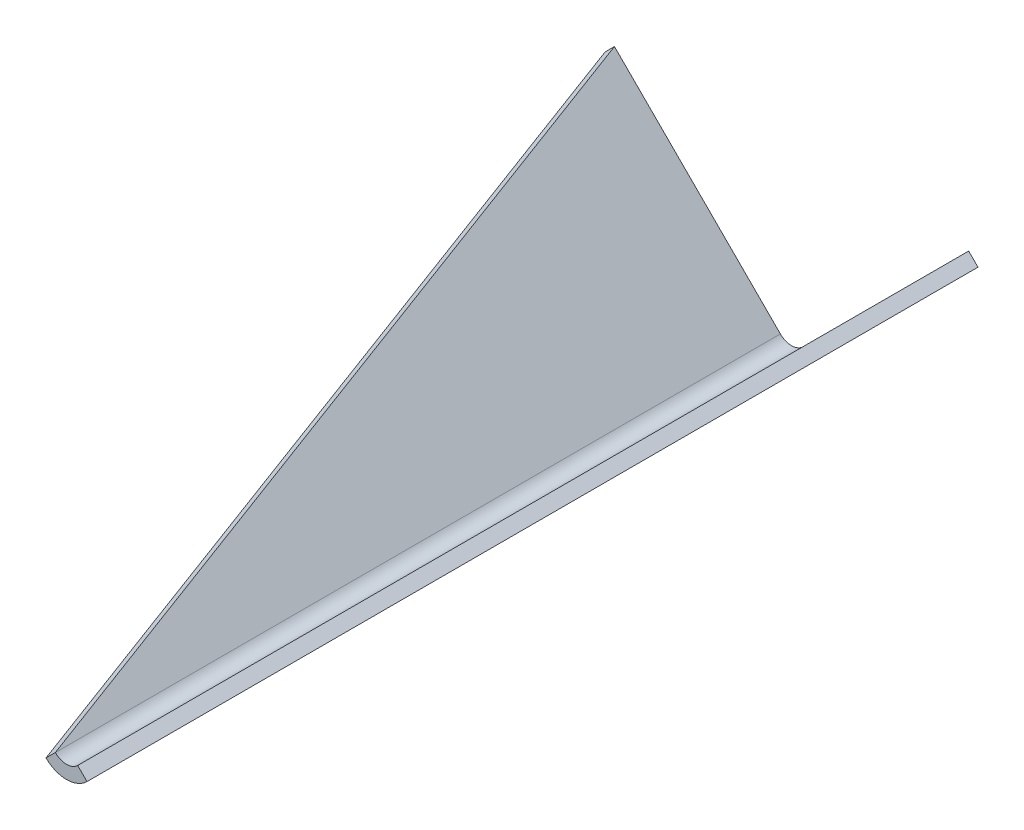
ISO-10303-21;
HEADER;
FILE_DESCRIPTION(('STEP AP214'),'2;1');
FILE_NAME('part.step','',(''),(''),'','','');
FILE_SCHEMA(('AUTOMOTIVE_DESIGN { 1 0 10303 214 1 1 1 1 }'));
ENDSEC;
DATA;
#1=APPLICATION_CONTEXT('core data for automotive mechanical design processes');
#2=APPLICATION_PROTOCOL_DEFINITION('international standard','automotive_design',2000,#1);
#3=PRODUCT_CONTEXT('',#1,'mechanical');
#4=PRODUCT('Part','Part','',(#3));
#5=PRODUCT_RELATED_PRODUCT_CATEGORY('part','',(#4));
#6=PRODUCT_DEFINITION_FORMATION('','',#4);
#7=PRODUCT_DEFINITION_CONTEXT('part definition',#1,'design');
#8=PRODUCT_DEFINITION('design','',#6,#7);
#9=PRODUCT_DEFINITION_SHAPE('','',#8);
#10=(LENGTH_UNIT() NAMED_UNIT(*) SI_UNIT(.MILLI.,.METRE.));
#11=(NAMED_UNIT(*) PLANE_ANGLE_UNIT() SI_UNIT($,.RADIAN.));
#12=(NAMED_UNIT(*) SI_UNIT($,.STERADIAN.) SOLID_ANGLE_UNIT());
#13=UNCERTAINTY_MEASURE_WITH_UNIT(LENGTH_MEASURE(1.E-05),#10,'distance_accuracy_value','');
#14=(GEOMETRIC_REPRESENTATION_CONTEXT(3) GLOBAL_UNCERTAINTY_ASSIGNED_CONTEXT((#13)) GLOBAL_UNIT_ASSIGNED_CONTEXT((#10,
#11,#12)) REPRESENTATION_CONTEXT('',''));
#15=CARTESIAN_POINT('',(0.,0.,0.));
#16=DIRECTION('',(0.,0.,1.));
#17=DIRECTION('',(1.,0.,0.));
#18=AXIS2_PLACEMENT_3D('',#15,#16,#17);
#19=CARTESIAN_POINT('',(-1.55563491861041,1.55563491861041,55.));
#20=DIRECTION('',(0.,0.,1.));
#21=DIRECTION('',(1.,0.,0.));
#22=AXIS2_PLACEMENT_3D('',#19,#20,#21);
#23=PLANE('',#22);
#24=DIRECTION('',(0.707106781186547,0.707106781186548,0.));
#25=VECTOR('',#24,1.);
#26=CARTESIAN_POINT('',(-1.55563491861041,1.55563491861041,55.));
#27=LINE('',#26,#25);
#28=CARTESIAN_POINT('',(-1.5556349186104,1.55563491861041,55.));
#29=VERTEX_POINT('',#28);
#30=CARTESIAN_POINT('',(-0.848528137423858,2.26274169979695,55.));
#31=VERTEX_POINT('',#30);
#32=EDGE_CURVE('E11',#29,#31,#27,.T.);
#33=ORIENTED_EDGE('',*,*,#32,.F.);
#34=CARTESIAN_POINT('',(0.,3.11126983722081,55.));
#35=DIRECTION('',(0.,0.,1.));
#36=DIRECTION('',(1.,0.,0.));
#37=AXIS2_PLACEMENT_3D('',#34,#35,#36);
#38=CIRCLE('',#37,2.2);
#39=CARTESIAN_POINT('',(1.55563491861041,1.5556349186104,55.));
#40=VERTEX_POINT('',#39);
#41=EDGE_CURVE('E110',#40,#29,#38,.F.);
#42=ORIENTED_EDGE('',*,*,#41,.F.);
#43=DIRECTION('',(0.707106781186548,-0.707106781186547,0.));
#44=VECTOR('',#43,1.);
#45=CARTESIAN_POINT('',(0.848528137423857,2.26274169979695,55.));
#46=LINE('',#45,#44);
#47=CARTESIAN_POINT('',(0.848528137423857,2.26274169979695,55.));
#48=VERTEX_POINT('',#47);
#49=EDGE_CURVE('E49',#48,#40,#46,.T.);
#50=ORIENTED_EDGE('',*,*,#49,.F.);
#51=CARTESIAN_POINT('',(0.,3.11126983722081,55.));
#52=DIRECTION('',(0.,0.,1.));
#53=DIRECTION('',(1.,0.,0.));
#54=AXIS2_PLACEMENT_3D('',#51,#52,#53);
#55=CIRCLE('',#54,1.2);
#56=EDGE_CURVE('E105',#48,#31,#55,.F.);
#57=ORIENTED_EDGE('',*,*,#56,.T.);
#58=EDGE_LOOP('',(#33,#42,#50,#57));
#59=FACE_BOUND('',#58,.T.);
#60=ADVANCED_FACE('F41',(#59),#23,.T.);
#61=CARTESIAN_POINT('',(1.55563491861041,1.55563491861041,0.));
#62=DIRECTION('',(0.,0.,-1.));
#63=DIRECTION('',(-1.,0.,0.));
#64=AXIS2_PLACEMENT_3D('',#61,#62,#63);
#65=PLANE('',#64);
#66=DIRECTION('',(-0.707106781186548,0.707106781186547,0.));
#67=VECTOR('',#66,1.);
#68=CARTESIAN_POINT('',(1.55563491861041,1.55563491861041,0.));
#69=LINE('',#68,#67);
#70=CARTESIAN_POINT('',(1.55563491861041,1.55563491861041,0.));
#71=VERTEX_POINT('',#70);
#72=CARTESIAN_POINT('',(0.848528137423857,2.26274169979695,0.));
#73=VERTEX_POINT('',#72);
#74=EDGE_CURVE('E76',#71,#73,#69,.T.);
#75=ORIENTED_EDGE('',*,*,#74,.F.);
#76=CARTESIAN_POINT('',(0.,3.11126983722081,0.));
#77=DIRECTION('',(0.,0.,1.));
#78=DIRECTION('',(1.,0.,0.));
#79=AXIS2_PLACEMENT_3D('',#76,#77,#78);
#80=CIRCLE('',#79,2.2);
#81=CARTESIAN_POINT('',(-1.55563491861041,1.55563491861041,0.));
#82=VERTEX_POINT('',#81);
#83=EDGE_CURVE('E138',#71,#82,#80,.F.);
#84=ORIENTED_EDGE('',*,*,#83,.T.);
#85=DIRECTION('',(-0.707106781186547,-0.707106781186548,0.));
#86=VECTOR('',#85,1.);
#87=CARTESIAN_POINT('',(-0.848528137423858,2.26274169979695,0.));
#88=LINE('',#87,#86);
#89=CARTESIAN_POINT('',(-0.848528137423858,2.26274169979695,0.));
#90=VERTEX_POINT('',#89);
#91=EDGE_CURVE('E88',#90,#82,#88,.T.);
#92=ORIENTED_EDGE('',*,*,#91,.F.);
#93=CARTESIAN_POINT('',(0.,3.11126983722081,0.));
#94=DIRECTION('',(0.,0.,1.));
#95=DIRECTION('',(1.,0.,0.));
#96=AXIS2_PLACEMENT_3D('',#93,#94,#95);
#97=CIRCLE('',#96,1.2);
#98=EDGE_CURVE('E96',#73,#90,#97,.F.);
#99=ORIENTED_EDGE('',*,*,#98,.F.);
#100=EDGE_LOOP('',(#75,#84,#92,#99));
#101=FACE_BOUND('',#100,.T.);
#102=ADVANCED_FACE('F109',(#101),#65,.T.);
#103=CARTESIAN_POINT('',(-0.848528137423858,2.26274169979695,0.));
#104=DIRECTION('',(0.,0.,-1.));
#105=DIRECTION('',(-1.,0.,0.));
#106=AXIS2_PLACEMENT_3D('',#103,#104,#105);
#107=PLANE('',#106);
#108=DIRECTION('',(-0.707106781186548,-0.707106781186548,0.));
#109=VECTOR('',#108,1.);
#110=CARTESIAN_POINT('',(0.,0.,0.));
#111=LINE('',#110,#109);
#112=CARTESIAN_POINT('',(14.1421356237309,14.142135623731,0.));
#113=VERTEX_POINT('',#112);
#114=EDGE_CURVE('E83',#113,#71,#111,.T.);
#115=ORIENTED_EDGE('',*,*,#114,.T.);
#116=ORIENTED_EDGE('',*,*,#74,.T.);
#117=DIRECTION('',(-0.707106781186548,-0.707106781186548,0.));
#118=VECTOR('',#117,1.);
#119=CARTESIAN_POINT('',(-0.707106781186547,0.707106781186547,0.));
#120=LINE('',#119,#118);
#121=CARTESIAN_POINT('',(13.4350288425444,14.8492424049175,0.));
#122=VERTEX_POINT('',#121);
#123=EDGE_CURVE('E81',#122,#73,#120,.T.);
#124=ORIENTED_EDGE('',*,*,#123,.F.);
#125=DIRECTION('',(0.707106781186544,-0.707106781186551,0.));
#126=VECTOR('',#125,1.);
#127=CARTESIAN_POINT('',(13.4350288425444,14.8492424049175,0.));
#128=LINE('',#127,#126);
#129=EDGE_CURVE('E97',#122,#113,#128,.T.);
#130=ORIENTED_EDGE('',*,*,#129,.T.);
#131=EDGE_LOOP('',(#115,#116,#124,#130));
#132=FACE_BOUND('',#131,.T.);
#133=ADVANCED_FACE('F78',(#132),#107,.T.);
#134=CARTESIAN_POINT('',(0.707106781186547,0.707106781186547,55.));
#135=DIRECTION('',(-0.707106781186548,-0.707106781186548,0.));
#136=DIRECTION('',(0.707106781186548,-0.707106781186548,0.));
#137=AXIS2_PLACEMENT_3D('',#134,#135,#136);
#138=PLANE('',#137);
#139=DIRECTION('',(-0.707106781186548,0.707106781186548,0.));
#140=VECTOR('',#139,1.);
#141=CARTESIAN_POINT('',(0.707106781186547,0.707106781186547,0.));
#142=LINE('',#141,#140);
#143=CARTESIAN_POINT('',(-13.4350288425444,14.8492424049175,0.));
#144=VERTEX_POINT('',#143);
#145=EDGE_CURVE('E167',#90,#144,#142,.T.);
#146=ORIENTED_EDGE('',*,*,#145,.T.);
#147=DIRECTION('',(0.217726944549541,-0.217726944549541,0.951414712538251));
#148=VECTOR('',#147,1.);
#149=CARTESIAN_POINT('',(-0.701038321151229,2.11525188352432,55.6444952481268));
#150=LINE('',#149,#148);
#151=EDGE_CURVE('E164',#144,#31,#150,.T.);
#152=ORIENTED_EDGE('',*,*,#151,.T.);
#153=DIRECTION('',(0.,0.,-1.));
#154=VECTOR('',#153,1.);
#155=CARTESIAN_POINT('',(-0.848528137423858,2.26274169979695,55.));
#156=LINE('',#155,#154);
#157=EDGE_CURVE('E107',#31,#90,#156,.T.);
#158=ORIENTED_EDGE('',*,*,#157,.T.);
#159=EDGE_LOOP('',(#146,#152,#158));
#160=FACE_BOUND('',#159,.T.);
#161=ADVANCED_FACE('F174',(#160),#138,.F.);
#162=CARTESIAN_POINT('',(0.,0.,55.));
#163=DIRECTION('',(-0.707106781186548,-0.707106781186548,0.));
#164=DIRECTION('',(0.707106781186548,-0.707106781186548,0.));
#165=AXIS2_PLACEMENT_3D('',#162,#163,#164);
#166=PLANE('',#165);
#167=DIRECTION('',(0.217726944549541,-0.217726944549541,0.951414712538251));
#168=VECTOR('',#167,1.);
#169=CARTESIAN_POINT('',(-14.1421356237309,14.1421356237309,0.));
#170=LINE('',#169,#168);
#171=CARTESIAN_POINT('',(-14.1421356237309,14.1421356237309,0.));
#172=VERTEX_POINT('',#171);
#173=EDGE_CURVE('E149',#172,#29,#170,.T.);
#174=ORIENTED_EDGE('',*,*,#173,.F.);
#175=DIRECTION('',(-0.707106781186548,0.707106781186548,0.));
#176=VECTOR('',#175,1.);
#177=CARTESIAN_POINT('',(0.,0.,0.));
#178=LINE('',#177,#176);
#179=EDGE_CURVE('E151',#82,#172,#178,.T.);
#180=ORIENTED_EDGE('',*,*,#179,.F.);
#181=DIRECTION('',(0.,0.,-1.));
#182=VECTOR('',#181,1.);
#183=CARTESIAN_POINT('',(-1.55563491861041,1.55563491861041,55.));
#184=LINE('',#183,#182);
#185=EDGE_CURVE('E118',#29,#82,#184,.T.);
#186=ORIENTED_EDGE('',*,*,#185,.F.);
#187=EDGE_LOOP('',(#174,#180,#186));
#188=FACE_BOUND('',#187,.T.);
#189=ADVANCED_FACE('F148',(#188),#166,.T.);
#190=CARTESIAN_POINT('',(0.,3.11126983722081,55.));
#191=DIRECTION('',(0.,0.,-1.));
#192=DIRECTION('',(-1.,0.,0.));
#193=AXIS2_PLACEMENT_3D('',#190,#191,#192);
#194=CYLINDRICAL_SURFACE('',#193,2.2);
#195=ORIENTED_EDGE('',*,*,#83,.F.);
#196=DIRECTION('',(0.,0.,-1.));
#197=VECTOR('',#196,1.);
#198=CARTESIAN_POINT('',(1.55563491861041,1.55563491861041,55.));
#199=LINE('',#198,#197);
#200=EDGE_CURVE('E106',#40,#71,#199,.T.);
#201=ORIENTED_EDGE('',*,*,#200,.F.);
#202=ORIENTED_EDGE('',*,*,#41,.T.);
#203=ORIENTED_EDGE('',*,*,#185,.T.);
#204=EDGE_LOOP('',(#195,#201,#202,#203));
#205=FACE_BOUND('',#204,.T.);
#206=ADVANCED_FACE('F136',(#205),#194,.T.);
#207=CARTESIAN_POINT('',(0.,0.,55.));
#208=DIRECTION('',(0.707106781186548,-0.707106781186548,0.));
#209=DIRECTION('',(0.707106781186548,0.707106781186548,0.));
#210=AXIS2_PLACEMENT_3D('',#207,#208,#209);
#211=PLANE('',#210);
#212=DIRECTION('',(0.21772694454954,0.217726944549541,-0.951414712538251));
#213=VECTOR('',#212,1.);
#214=CARTESIAN_POINT('',(12.8013191121616,12.8013191121616,5.85904771024346));
#215=LINE('',#214,#213);
#216=EDGE_CURVE('E126',#40,#113,#215,.T.);
#217=ORIENTED_EDGE('',*,*,#216,.F.);
#218=ORIENTED_EDGE('',*,*,#200,.T.);
#219=ORIENTED_EDGE('',*,*,#114,.F.);
#220=EDGE_LOOP('',(#217,#218,#219));
#221=FACE_BOUND('',#220,.T.);
#222=ADVANCED_FACE('F132',(#221),#211,.T.);
#223=CARTESIAN_POINT('',(-0.707106781186547,0.707106781186547,55.));
#224=DIRECTION('',(0.707106781186548,-0.707106781186548,0.));
#225=DIRECTION('',(0.707106781186548,0.707106781186548,0.));
#226=AXIS2_PLACEMENT_3D('',#223,#224,#225);
#227=PLANE('',#226);
#228=DIRECTION('',(0.,0.,-1.));
#229=VECTOR('',#228,1.);
#230=CARTESIAN_POINT('',(0.848528137423857,2.26274169979695,55.));
#231=LINE('',#230,#229);
#232=EDGE_CURVE('E94',#48,#73,#231,.T.);
#233=ORIENTED_EDGE('',*,*,#232,.F.);
#234=DIRECTION('',(0.217726944549541,0.217726944549541,-0.951414712538251));
#235=VECTOR('',#234,1.);
#236=CARTESIAN_POINT('',(0.701038321151228,2.11525188352432,55.6444952481268));
#237=LINE('',#236,#235);
#238=EDGE_CURVE('E56',#48,#122,#237,.T.);
#239=ORIENTED_EDGE('',*,*,#238,.T.);
#240=ORIENTED_EDGE('',*,*,#123,.T.);
#241=EDGE_LOOP('',(#233,#239,#240));
#242=FACE_BOUND('',#241,.T.);
#243=ADVANCED_FACE('F93',(#242),#227,.F.);
#244=CARTESIAN_POINT('',(0.,3.11126983722081,55.));
#245=DIRECTION('',(0.,0.,-1.));
#246=DIRECTION('',(-1.,0.,0.));
#247=AXIS2_PLACEMENT_3D('',#244,#245,#246);
#248=CYLINDRICAL_SURFACE('',#247,1.2);
#249=ORIENTED_EDGE('',*,*,#98,.T.);
#250=ORIENTED_EDGE('',*,*,#157,.F.);
#251=ORIENTED_EDGE('',*,*,#56,.F.);
#252=ORIENTED_EDGE('',*,*,#232,.T.);
#253=EDGE_LOOP('',(#249,#250,#251,#252));
#254=FACE_BOUND('',#253,.T.);
#255=ADVANCED_FACE('F101',(#254),#248,.F.);
#256=CARTESIAN_POINT('',(0.,3.11126983722081,0.));
#257=DIRECTION('',(0.,0.,1.));
#258=DIRECTION('',(1.,0.,0.));
#259=AXIS2_PLACEMENT_3D('',#256,#257,#258);
#260=PLANE('',#259);
#261=ORIENTED_EDGE('',*,*,#145,.F.);
#262=ORIENTED_EDGE('',*,*,#91,.T.);
#263=ORIENTED_EDGE('',*,*,#179,.T.);
#264=DIRECTION('',(0.707106781186544,0.707106781186551,0.));
#265=VECTOR('',#264,1.);
#266=CARTESIAN_POINT('',(-14.1421356237309,14.1421356237309,0.));
#267=LINE('',#266,#265);
#268=EDGE_CURVE('E154',#172,#144,#267,.T.);
#269=ORIENTED_EDGE('',*,*,#268,.T.);
#270=EDGE_LOOP('',(#261,#262,#263,#269));
#271=FACE_BOUND('',#270,.T.);
#272=ADVANCED_FACE('F175',(#271),#260,.F.);
#273=CARTESIAN_POINT('',(-7.07106781186547,21.2132034355964,0.));
#274=DIRECTION('',(0.672751794956447,-0.672751794956447,-0.307912397876016));
#275=DIRECTION('',(0.707106781186548,0.707106781186547,0.));
#276=AXIS2_PLACEMENT_3D('',#273,#274,#275);
#277=PLANE('',#276);
#278=ORIENTED_EDGE('',*,*,#268,.F.);
#279=ORIENTED_EDGE('',*,*,#173,.T.);
#280=ORIENTED_EDGE('',*,*,#32,.T.);
#281=ORIENTED_EDGE('',*,*,#151,.F.);
#282=EDGE_LOOP('',(#278,#279,#280,#281));
#283=FACE_BOUND('',#282,.T.);
#284=ADVANCED_FACE('F163',(#283),#277,.F.);
#285=CARTESIAN_POINT('',(5.73025130029609,19.8723869240271,5.85904771024346));
#286=DIRECTION('',(-0.672751794956446,-0.672751794956448,-0.307912397876016));
#287=DIRECTION('',(0.707106781186549,-0.707106781186546,0.));
#288=AXIS2_PLACEMENT_3D('',#285,#286,#287);
#289=PLANE('',#288);
#290=ORIENTED_EDGE('',*,*,#49,.T.);
#291=ORIENTED_EDGE('',*,*,#216,.T.);
#292=ORIENTED_EDGE('',*,*,#129,.F.);
#293=ORIENTED_EDGE('',*,*,#238,.F.);
#294=EDGE_LOOP('',(#290,#291,#292,#293));
#295=FACE_BOUND('',#294,.T.);
#296=ADVANCED_FACE('F124',(#295),#289,.F.);
#297=CLOSED_SHELL('',(#60,#102,#133,#161,#189,#206,#222,#243,#255,#272,#284,#296));
#298=MANIFOLD_SOLID_BREP('B2',#297);
#299=ADVANCED_BREP_SHAPE_REPRESENTATION('',(#18,#298),#14);
#300=SHAPE_DEFINITION_REPRESENTATION(#9,#299);
ENDSEC;
END-ISO-10303-21;
